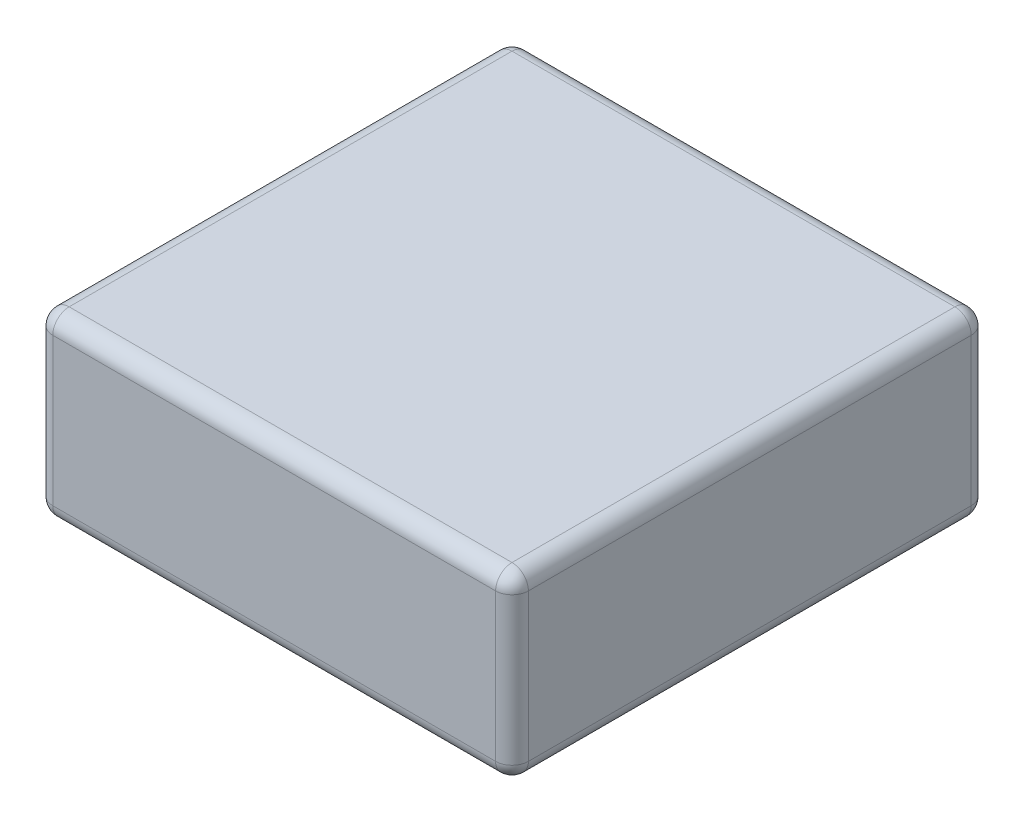
ISO-10303-21;
HEADER;
FILE_DESCRIPTION(('STEP AP214'),'2;1');
FILE_NAME('part.step','',(''),(''),'','','');
FILE_SCHEMA(('AUTOMOTIVE_DESIGN { 1 0 10303 214 1 1 1 1 }'));
ENDSEC;
DATA;
#1=APPLICATION_CONTEXT('core data for automotive mechanical design processes');
#2=APPLICATION_PROTOCOL_DEFINITION('international standard','automotive_design',2000,#1);
#3=PRODUCT_CONTEXT('',#1,'mechanical');
#4=PRODUCT('Part','Part','',(#3));
#5=PRODUCT_RELATED_PRODUCT_CATEGORY('part','',(#4));
#6=PRODUCT_DEFINITION_FORMATION('','',#4);
#7=PRODUCT_DEFINITION_CONTEXT('part definition',#1,'design');
#8=PRODUCT_DEFINITION('design','',#6,#7);
#9=PRODUCT_DEFINITION_SHAPE('','',#8);
#10=(LENGTH_UNIT() NAMED_UNIT(*) SI_UNIT(.MILLI.,.METRE.));
#11=(NAMED_UNIT(*) PLANE_ANGLE_UNIT() SI_UNIT($,.RADIAN.));
#12=(NAMED_UNIT(*) SI_UNIT($,.STERADIAN.) SOLID_ANGLE_UNIT());
#13=UNCERTAINTY_MEASURE_WITH_UNIT(LENGTH_MEASURE(1.E-05),#10,'distance_accuracy_value','');
#14=(GEOMETRIC_REPRESENTATION_CONTEXT(3) GLOBAL_UNCERTAINTY_ASSIGNED_CONTEXT((#13)) GLOBAL_UNIT_ASSIGNED_CONTEXT((#10,
#11,#12)) REPRESENTATION_CONTEXT('',''));
#15=CARTESIAN_POINT('',(0.,0.,0.));
#16=DIRECTION('',(0.,0.,1.));
#17=DIRECTION('',(1.,0.,0.));
#18=AXIS2_PLACEMENT_3D('',#15,#16,#17);
#19=CARTESIAN_POINT('',(9.96034875527012,-1.1,12.1194559594392));
#20=DIRECTION('',(0.,-1.,0.));
#21=DIRECTION('',(0.,0.,-1.));
#22=AXIS2_PLACEMENT_3D('',#19,#20,#21);
#23=PLANE('',#22);
#24=DIRECTION('',(1.,0.,0.));
#25=VECTOR('',#24,1.);
#26=CARTESIAN_POINT('',(10.6853487552701,-1.1,13.4694559594392));
#27=LINE('',#26,#25);
#28=CARTESIAN_POINT('',(8.61034875527012,-1.1,13.4694559594392));
#29=VERTEX_POINT('',#28);
#30=CARTESIAN_POINT('',(11.3103487552701,-1.1,13.4694559594392));
#31=VERTEX_POINT('',#30);
#32=EDGE_CURVE('E197',#29,#31,#27,.T.);
#33=ORIENTED_EDGE('',*,*,#32,.F.);
#34=DIRECTION('',(0.,0.,1.));
#35=VECTOR('',#34,1.);
#36=CARTESIAN_POINT('',(8.61034875527012,-1.1,12.8444559594392));
#37=LINE('',#36,#35);
#38=CARTESIAN_POINT('',(8.61034875527012,-1.1,10.7694559594392));
#39=VERTEX_POINT('',#38);
#40=EDGE_CURVE('E202',#39,#29,#37,.T.);
#41=ORIENTED_EDGE('',*,*,#40,.F.);
#42=DIRECTION('',(-1.,0.,0.));
#43=VECTOR('',#42,1.);
#44=CARTESIAN_POINT('',(9.23534875527012,-1.1,10.7694559594392));
#45=LINE('',#44,#43);
#46=CARTESIAN_POINT('',(11.3103487552701,-1.1,10.7694559594392));
#47=VERTEX_POINT('',#46);
#48=EDGE_CURVE('E134',#47,#39,#45,.T.);
#49=ORIENTED_EDGE('',*,*,#48,.F.);
#50=DIRECTION('',(0.,0.,-1.));
#51=VECTOR('',#50,1.);
#52=CARTESIAN_POINT('',(11.3103487552701,-1.1,11.3944559594392));
#53=LINE('',#52,#51);
#54=EDGE_CURVE('E196',#31,#47,#53,.T.);
#55=ORIENTED_EDGE('',*,*,#54,.F.);
#56=EDGE_LOOP('',(#33,#41,#49,#55));
#57=FACE_BOUND('',#56,.T.);
#58=ADVANCED_FACE('F16',(#57),#23,.T.);
#59=CARTESIAN_POINT('',(11.4103487552701,0.,10.6694559594392));
#60=DIRECTION('',(1.,0.,0.));
#61=DIRECTION('',(0.,1.,0.));
#62=AXIS2_PLACEMENT_3D('',#59,#60,#61);
#63=PLANE('',#62);
#64=DIRECTION('',(0.,0.,-1.));
#65=VECTOR('',#64,1.);
#66=CARTESIAN_POINT('',(11.4103487552701,-0.1,11.3944559594392));
#67=LINE('',#66,#65);
#68=CARTESIAN_POINT('',(11.4103487552701,-0.1,13.4694559594392));
#69=VERTEX_POINT('',#68);
#70=CARTESIAN_POINT('',(11.4103487552701,-0.1,10.7694559594392));
#71=VERTEX_POINT('',#70);
#72=EDGE_CURVE('E126',#69,#71,#67,.T.);
#73=ORIENTED_EDGE('',*,*,#72,.F.);
#74=DIRECTION('',(0.,1.,0.));
#75=VECTOR('',#74,1.);
#76=CARTESIAN_POINT('',(11.4103487552701,0.,13.4694559594392));
#77=LINE('',#76,#75);
#78=CARTESIAN_POINT('',(11.4103487552701,-1.,13.4694559594392));
#79=VERTEX_POINT('',#78);
#80=EDGE_CURVE('E237',#79,#69,#77,.T.);
#81=ORIENTED_EDGE('',*,*,#80,.F.);
#82=DIRECTION('',(0.,0.,1.));
#83=VECTOR('',#82,1.);
#84=CARTESIAN_POINT('',(11.4103487552701,-1.,11.3944559594392));
#85=LINE('',#84,#83);
#86=CARTESIAN_POINT('',(11.4103487552701,-1.,10.7694559594392));
#87=VERTEX_POINT('',#86);
#88=EDGE_CURVE('E128',#87,#79,#85,.T.);
#89=ORIENTED_EDGE('',*,*,#88,.F.);
#90=DIRECTION('',(0.,-1.,0.));
#91=VECTOR('',#90,1.);
#92=CARTESIAN_POINT('',(11.4103487552701,0.,10.7694559594392));
#93=LINE('',#92,#91);
#94=EDGE_CURVE('E123',#71,#87,#93,.T.);
#95=ORIENTED_EDGE('',*,*,#94,.F.);
#96=EDGE_LOOP('',(#73,#81,#89,#95));
#97=FACE_BOUND('',#96,.T.);
#98=ADVANCED_FACE('F18',(#97),#63,.T.);
#99=CARTESIAN_POINT('',(11.4103487552701,0.,13.5694559594392));
#100=DIRECTION('',(0.,0.,1.));
#101=DIRECTION('',(1.,0.,0.));
#102=AXIS2_PLACEMENT_3D('',#99,#100,#101);
#103=PLANE('',#102);
#104=DIRECTION('',(0.,1.,0.));
#105=VECTOR('',#104,1.);
#106=CARTESIAN_POINT('',(8.61034875527012,0.,13.5694559594392));
#107=LINE('',#106,#105);
#108=CARTESIAN_POINT('',(8.61034875527012,-1.,13.5694559594392));
#109=VERTEX_POINT('',#108);
#110=CARTESIAN_POINT('',(8.61034875527012,-0.1,13.5694559594392));
#111=VERTEX_POINT('',#110);
#112=EDGE_CURVE('E261',#109,#111,#107,.T.);
#113=ORIENTED_EDGE('',*,*,#112,.F.);
#114=DIRECTION('',(-1.,0.,0.));
#115=VECTOR('',#114,1.);
#116=CARTESIAN_POINT('',(10.6853487552701,-1.,13.5694559594392));
#117=LINE('',#116,#115);
#118=CARTESIAN_POINT('',(11.3103487552701,-1.,13.5694559594392));
#119=VERTEX_POINT('',#118);
#120=EDGE_CURVE('E192',#119,#109,#117,.T.);
#121=ORIENTED_EDGE('',*,*,#120,.F.);
#122=DIRECTION('',(0.,-1.,0.));
#123=VECTOR('',#122,1.);
#124=CARTESIAN_POINT('',(11.3103487552701,0.,13.5694559594392));
#125=LINE('',#124,#123);
#126=CARTESIAN_POINT('',(11.3103487552701,-0.1,13.5694559594392));
#127=VERTEX_POINT('',#126);
#128=EDGE_CURVE('E239',#127,#119,#125,.T.);
#129=ORIENTED_EDGE('',*,*,#128,.F.);
#130=DIRECTION('',(1.,0.,0.));
#131=VECTOR('',#130,1.);
#132=CARTESIAN_POINT('',(10.6853487552701,-0.1,13.5694559594392));
#133=LINE('',#132,#131);
#134=EDGE_CURVE('E234',#111,#127,#133,.T.);
#135=ORIENTED_EDGE('',*,*,#134,.F.);
#136=EDGE_LOOP('',(#113,#121,#129,#135));
#137=FACE_BOUND('',#136,.T.);
#138=ADVANCED_FACE('F712',(#137),#103,.T.);
#139=CARTESIAN_POINT('',(8.51034875527012,0.,13.5694559594392));
#140=DIRECTION('',(-1.,0.,0.));
#141=DIRECTION('',(0.,0.,1.));
#142=AXIS2_PLACEMENT_3D('',#139,#140,#141);
#143=PLANE('',#142);
#144=DIRECTION('',(0.,0.,1.));
#145=VECTOR('',#144,1.);
#146=CARTESIAN_POINT('',(8.51034875527012,-0.1,12.8444559594392));
#147=LINE('',#146,#145);
#148=CARTESIAN_POINT('',(8.51034875527012,-0.1,10.7694559594392));
#149=VERTEX_POINT('',#148);
#150=CARTESIAN_POINT('',(8.51034875527012,-0.1,13.4694559594392));
#151=VERTEX_POINT('',#150);
#152=EDGE_CURVE('E20',#149,#151,#147,.T.);
#153=ORIENTED_EDGE('',*,*,#152,.F.);
#154=DIRECTION('',(0.,1.,0.));
#155=VECTOR('',#154,1.);
#156=CARTESIAN_POINT('',(8.51034875527012,0.,10.7694559594392));
#157=LINE('',#156,#155);
#158=CARTESIAN_POINT('',(8.51034875527012,-1.,10.7694559594392));
#159=VERTEX_POINT('',#158);
#160=EDGE_CURVE('E27',#159,#149,#157,.T.);
#161=ORIENTED_EDGE('',*,*,#160,.F.);
#162=DIRECTION('',(0.,0.,-1.));
#163=VECTOR('',#162,1.);
#164=CARTESIAN_POINT('',(8.51034875527012,-1.,12.8444559594392));
#165=LINE('',#164,#163);
#166=CARTESIAN_POINT('',(8.51034875527012,-1.,13.4694559594392));
#167=VERTEX_POINT('',#166);
#168=EDGE_CURVE('E283',#167,#159,#165,.T.);
#169=ORIENTED_EDGE('',*,*,#168,.F.);
#170=DIRECTION('',(0.,-1.,0.));
#171=VECTOR('',#170,1.);
#172=CARTESIAN_POINT('',(8.51034875527012,0.,13.4694559594392));
#173=LINE('',#172,#171);
#174=EDGE_CURVE('E265',#151,#167,#173,.T.);
#175=ORIENTED_EDGE('',*,*,#174,.F.);
#176=EDGE_LOOP('',(#153,#161,#169,#175));
#177=FACE_BOUND('',#176,.T.);
#178=ADVANCED_FACE('F381',(#177),#143,.T.);
#179=CARTESIAN_POINT('',(9.96034875527012,0.,12.1194559594392));
#180=DIRECTION('',(0.,-1.,0.));
#181=DIRECTION('',(0.,0.,-1.));
#182=AXIS2_PLACEMENT_3D('',#179,#180,#181);
#183=PLANE('',#182);
#184=DIRECTION('',(1.,0.,0.));
#185=VECTOR('',#184,1.);
#186=CARTESIAN_POINT('',(9.23534875527012,0.,10.7694559594392));
#187=LINE('',#186,#185);
#188=CARTESIAN_POINT('',(8.61034875527012,0.,10.7694559594392));
#189=VERTEX_POINT('',#188);
#190=CARTESIAN_POINT('',(11.3103487552701,0.,10.7694559594392));
#191=VERTEX_POINT('',#190);
#192=EDGE_CURVE('E181',#189,#191,#187,.T.);
#193=ORIENTED_EDGE('',*,*,#192,.F.);
#194=DIRECTION('',(0.,0.,-1.));
#195=VECTOR('',#194,1.);
#196=CARTESIAN_POINT('',(8.61034875527012,0.,12.8444559594392));
#197=LINE('',#196,#195);
#198=CARTESIAN_POINT('',(8.61034875527012,0.,13.4694559594392));
#199=VERTEX_POINT('',#198);
#200=EDGE_CURVE('E266',#199,#189,#197,.T.);
#201=ORIENTED_EDGE('',*,*,#200,.F.);
#202=DIRECTION('',(-1.,0.,0.));
#203=VECTOR('',#202,1.);
#204=CARTESIAN_POINT('',(10.6853487552701,0.,13.4694559594392));
#205=LINE('',#204,#203);
#206=CARTESIAN_POINT('',(11.3103487552701,0.,13.4694559594392));
#207=VERTEX_POINT('',#206);
#208=EDGE_CURVE('E41',#207,#199,#205,.T.);
#209=ORIENTED_EDGE('',*,*,#208,.F.);
#210=DIRECTION('',(0.,0.,1.));
#211=VECTOR('',#210,1.);
#212=CARTESIAN_POINT('',(11.3103487552701,0.,11.3944559594392));
#213=LINE('',#212,#211);
#214=EDGE_CURVE('E147',#191,#207,#213,.T.);
#215=ORIENTED_EDGE('',*,*,#214,.F.);
#216=EDGE_LOOP('',(#193,#201,#209,#215));
#217=FACE_BOUND('',#216,.T.);
#218=ADVANCED_FACE('F321',(#217),#183,.F.);
#219=CARTESIAN_POINT('',(8.51034875527012,0.,10.6694559594392));
#220=DIRECTION('',(0.,0.,-1.));
#221=DIRECTION('',(0.,-1.,0.));
#222=AXIS2_PLACEMENT_3D('',#219,#220,#221);
#223=PLANE('',#222);
#224=DIRECTION('',(-1.,0.,0.));
#225=VECTOR('',#224,1.);
#226=CARTESIAN_POINT('',(9.23534875527012,-0.1,10.6694559594392));
#227=LINE('',#226,#225);
#228=CARTESIAN_POINT('',(11.3103487552701,-0.1,10.6694559594392));
#229=VERTEX_POINT('',#228);
#230=CARTESIAN_POINT('',(8.61034875527012,-0.1,10.6694559594392));
#231=VERTEX_POINT('',#230);
#232=EDGE_CURVE('E157',#229,#231,#227,.T.);
#233=ORIENTED_EDGE('',*,*,#232,.F.);
#234=DIRECTION('',(0.,1.,0.));
#235=VECTOR('',#234,1.);
#236=CARTESIAN_POINT('',(11.3103487552701,0.,10.6694559594392));
#237=LINE('',#236,#235);
#238=CARTESIAN_POINT('',(11.3103487552701,-1.,10.6694559594392));
#239=VERTEX_POINT('',#238);
#240=EDGE_CURVE('E135',#239,#229,#237,.T.);
#241=ORIENTED_EDGE('',*,*,#240,.F.);
#242=DIRECTION('',(1.,0.,0.));
#243=VECTOR('',#242,1.);
#244=CARTESIAN_POINT('',(9.23534875527012,-1.,10.6694559594392));
#245=LINE('',#244,#243);
#246=CARTESIAN_POINT('',(8.61034875527012,-1.,10.6694559594392));
#247=VERTEX_POINT('',#246);
#248=EDGE_CURVE('E198',#247,#239,#245,.T.);
#249=ORIENTED_EDGE('',*,*,#248,.F.);
#250=DIRECTION('',(0.,-1.,0.));
#251=VECTOR('',#250,1.);
#252=CARTESIAN_POINT('',(8.61034875527012,0.,10.6694559594392));
#253=LINE('',#252,#251);
#254=EDGE_CURVE('E10',#231,#247,#253,.T.);
#255=ORIENTED_EDGE('',*,*,#254,.F.);
#256=EDGE_LOOP('',(#233,#241,#249,#255));
#257=FACE_BOUND('',#256,.T.);
#258=ADVANCED_FACE('F374',(#257),#223,.T.);
#259=CARTESIAN_POINT('',(8.61034875527012,0.,10.7694559594392));
#260=DIRECTION('',(0.,-1.,0.));
#261=DIRECTION('',(-0.70710678118654,0.,-0.707106781186555));
#262=AXIS2_PLACEMENT_3D('',#259,#260,#261);
#263=CYLINDRICAL_SURFACE('',#262,0.1);
#264=CARTESIAN_POINT('',(8.61034875527012,-1.,10.7694559594392));
#265=DIRECTION('',(0.,1.,0.));
#266=DIRECTION('',(0.,0.,-1.));
#267=AXIS2_PLACEMENT_3D('',#264,#265,#266);
#268=CIRCLE('',#267,0.1);
#269=EDGE_CURVE('E182',#247,#159,#268,.T.);
#270=ORIENTED_EDGE('',*,*,#269,.T.);
#271=ORIENTED_EDGE('',*,*,#160,.T.);
#272=CARTESIAN_POINT('',(8.61034875527012,-0.1,10.7694559594392));
#273=DIRECTION('',(0.,-1.,0.));
#274=DIRECTION('',(-1.,0.,0.));
#275=AXIS2_PLACEMENT_3D('',#272,#273,#274);
#276=CIRCLE('',#275,0.1);
#277=EDGE_CURVE('E191',#149,#231,#276,.T.);
#278=ORIENTED_EDGE('',*,*,#277,.T.);
#279=ORIENTED_EDGE('',*,*,#254,.T.);
#280=EDGE_LOOP('',(#270,#271,#278,#279));
#281=FACE_BOUND('',#280,.T.);
#282=ADVANCED_FACE('F376',(#281),#263,.T.);
#283=CARTESIAN_POINT('',(8.61034875527012,-1.,12.8444559594392));
#284=DIRECTION('',(0.,0.,-1.));
#285=DIRECTION('',(-0.707106781186548,-0.707106781186548,0.));
#286=AXIS2_PLACEMENT_3D('',#283,#284,#285);
#287=CYLINDRICAL_SURFACE('',#286,0.1);
#288=CARTESIAN_POINT('',(8.61034875527012,-1.,10.7694559594392));
#289=DIRECTION('',(0.,0.,1.));
#290=DIRECTION('',(-1.,0.,0.));
#291=AXIS2_PLACEMENT_3D('',#288,#289,#290);
#292=CIRCLE('',#291,0.1);
#293=EDGE_CURVE('E187',#159,#39,#292,.T.);
#294=ORIENTED_EDGE('',*,*,#293,.T.);
#295=ORIENTED_EDGE('',*,*,#40,.T.);
#296=CARTESIAN_POINT('',(8.61034875527012,-1.,13.4694559594392));
#297=DIRECTION('',(0.,0.,-1.));
#298=DIRECTION('',(0.,-1.,0.));
#299=AXIS2_PLACEMENT_3D('',#296,#297,#298);
#300=CIRCLE('',#299,0.1);
#301=EDGE_CURVE('E206',#29,#167,#300,.T.);
#302=ORIENTED_EDGE('',*,*,#301,.T.);
#303=ORIENTED_EDGE('',*,*,#168,.T.);
#304=EDGE_LOOP('',(#294,#295,#302,#303));
#305=FACE_BOUND('',#304,.T.);
#306=ADVANCED_FACE('F673',(#305),#287,.T.);
#307=CARTESIAN_POINT('',(9.23534875527012,-1.,10.7694559594392));
#308=DIRECTION('',(1.,0.,0.));
#309=DIRECTION('',(0.,-0.70710678118654,-0.707106781186555));
#310=AXIS2_PLACEMENT_3D('',#307,#308,#309);
#311=CYLINDRICAL_SURFACE('',#310,0.1);
#312=CARTESIAN_POINT('',(11.3103487552701,-1.,10.7694559594392));
#313=DIRECTION('',(-1.,0.,0.));
#314=DIRECTION('',(0.,0.,-1.));
#315=AXIS2_PLACEMENT_3D('',#312,#313,#314);
#316=CIRCLE('',#315,0.1);
#317=EDGE_CURVE('E228',#239,#47,#316,.T.);
#318=ORIENTED_EDGE('',*,*,#317,.T.);
#319=ORIENTED_EDGE('',*,*,#48,.T.);
#320=CARTESIAN_POINT('',(8.61034875527012,-1.,10.7694559594392));
#321=DIRECTION('',(1.,0.,0.));
#322=DIRECTION('',(0.,-1.,0.));
#323=AXIS2_PLACEMENT_3D('',#320,#321,#322);
#324=CIRCLE('',#323,0.1);
#325=EDGE_CURVE('E186',#39,#247,#324,.T.);
#326=ORIENTED_EDGE('',*,*,#325,.T.);
#327=ORIENTED_EDGE('',*,*,#248,.T.);
#328=EDGE_LOOP('',(#318,#319,#326,#327));
#329=FACE_BOUND('',#328,.T.);
#330=ADVANCED_FACE('F369',(#329),#311,.T.);
#331=CARTESIAN_POINT('',(11.3103487552701,0.,10.7694559594392));
#332=DIRECTION('',(0.,-1.,0.));
#333=DIRECTION('',(0.707106781186563,0.,-0.707106781186532));
#334=AXIS2_PLACEMENT_3D('',#331,#332,#333);
#335=CYLINDRICAL_SURFACE('',#334,0.1);
#336=CARTESIAN_POINT('',(11.3103487552701,-1.,10.7694559594392));
#337=DIRECTION('',(0.,1.,0.));
#338=DIRECTION('',(1.,0.,0.));
#339=AXIS2_PLACEMENT_3D('',#336,#337,#338);
#340=CIRCLE('',#339,0.1);
#341=EDGE_CURVE('E171',#87,#239,#340,.T.);
#342=ORIENTED_EDGE('',*,*,#341,.T.);
#343=ORIENTED_EDGE('',*,*,#240,.T.);
#344=CARTESIAN_POINT('',(11.3103487552701,-0.1,10.7694559594392));
#345=DIRECTION('',(0.,-1.,0.));
#346=DIRECTION('',(0.,0.,-1.));
#347=AXIS2_PLACEMENT_3D('',#344,#345,#346);
#348=CIRCLE('',#347,0.0999999999999979);
#349=EDGE_CURVE('E153',#229,#71,#348,.T.);
#350=ORIENTED_EDGE('',*,*,#349,.T.);
#351=ORIENTED_EDGE('',*,*,#94,.T.);
#352=EDGE_LOOP('',(#342,#343,#350,#351));
#353=FACE_BOUND('',#352,.T.);
#354=ADVANCED_FACE('F159',(#353),#335,.T.);
#355=CARTESIAN_POINT('',(11.3103487552701,-1.,11.3944559594392));
#356=DIRECTION('',(0.,0.,1.));
#357=DIRECTION('',(0.707106781186555,-0.70710678118654,0.));
#358=AXIS2_PLACEMENT_3D('',#355,#356,#357);
#359=CYLINDRICAL_SURFACE('',#358,0.1);
#360=CARTESIAN_POINT('',(11.3103487552701,-1.,13.4694559594392));
#361=DIRECTION('',(0.,0.,-1.));
#362=DIRECTION('',(1.,0.,0.));
#363=AXIS2_PLACEMENT_3D('',#360,#361,#362);
#364=CIRCLE('',#363,0.1);
#365=EDGE_CURVE('E224',#79,#31,#364,.T.);
#366=ORIENTED_EDGE('',*,*,#365,.T.);
#367=ORIENTED_EDGE('',*,*,#54,.T.);
#368=CARTESIAN_POINT('',(11.3103487552701,-1.,10.7694559594392));
#369=DIRECTION('',(0.,0.,1.));
#370=DIRECTION('',(0.,-1.,0.));
#371=AXIS2_PLACEMENT_3D('',#368,#369,#370);
#372=CIRCLE('',#371,0.1);
#373=EDGE_CURVE('E163',#47,#87,#372,.T.);
#374=ORIENTED_EDGE('',*,*,#373,.T.);
#375=ORIENTED_EDGE('',*,*,#88,.T.);
#376=EDGE_LOOP('',(#366,#367,#374,#375));
#377=FACE_BOUND('',#376,.T.);
#378=ADVANCED_FACE('F649',(#377),#359,.T.);
#379=CARTESIAN_POINT('',(10.6853487552701,-1.,13.4694559594392));
#380=DIRECTION('',(-1.,0.,0.));
#381=DIRECTION('',(0.,-0.70710678118654,0.707106781186555));
#382=AXIS2_PLACEMENT_3D('',#379,#380,#381);
#383=CYLINDRICAL_SURFACE('',#382,0.1);
#384=CARTESIAN_POINT('',(8.61034875527012,-1.,13.4694559594392));
#385=DIRECTION('',(1.,0.,0.));
#386=DIRECTION('',(0.,0.,1.));
#387=AXIS2_PLACEMENT_3D('',#384,#385,#386);
#388=CIRCLE('',#387,0.1);
#389=EDGE_CURVE('E207',#109,#29,#388,.T.);
#390=ORIENTED_EDGE('',*,*,#389,.T.);
#391=ORIENTED_EDGE('',*,*,#32,.T.);
#392=CARTESIAN_POINT('',(11.3103487552701,-1.,13.4694559594392));
#393=DIRECTION('',(-1.,0.,0.));
#394=DIRECTION('',(0.,-1.,0.));
#395=AXIS2_PLACEMENT_3D('',#392,#393,#394);
#396=CIRCLE('',#395,0.1);
#397=EDGE_CURVE('E223',#31,#119,#396,.T.);
#398=ORIENTED_EDGE('',*,*,#397,.T.);
#399=ORIENTED_EDGE('',*,*,#120,.T.);
#400=EDGE_LOOP('',(#390,#391,#398,#399));
#401=FACE_BOUND('',#400,.T.);
#402=ADVANCED_FACE('F298',(#401),#383,.T.);
#403=CARTESIAN_POINT('',(11.3103487552701,0.,13.4694559594392));
#404=DIRECTION('',(0.,-1.,0.));
#405=DIRECTION('',(0.707106781186532,0.,0.707106781186563));
#406=AXIS2_PLACEMENT_3D('',#403,#404,#405);
#407=CYLINDRICAL_SURFACE('',#406,0.1);
#408=CARTESIAN_POINT('',(11.3103487552701,-1.,13.4694559594392));
#409=DIRECTION('',(0.,1.,0.));
#410=DIRECTION('',(0.,0.,1.));
#411=AXIS2_PLACEMENT_3D('',#408,#409,#410);
#412=CIRCLE('',#411,0.1);
#413=EDGE_CURVE('E219',#119,#79,#412,.T.);
#414=ORIENTED_EDGE('',*,*,#413,.T.);
#415=ORIENTED_EDGE('',*,*,#80,.T.);
#416=CARTESIAN_POINT('',(11.3103487552701,-0.1,13.4694559594392));
#417=DIRECTION('',(0.,-1.,0.));
#418=DIRECTION('',(1.,0.,0.));
#419=AXIS2_PLACEMENT_3D('',#416,#417,#418);
#420=CIRCLE('',#419,0.0999999999999979);
#421=EDGE_CURVE('E269',#69,#127,#420,.T.);
#422=ORIENTED_EDGE('',*,*,#421,.T.);
#423=ORIENTED_EDGE('',*,*,#128,.T.);
#424=EDGE_LOOP('',(#414,#415,#422,#423));
#425=FACE_BOUND('',#424,.T.);
#426=ADVANCED_FACE('F634',(#425),#407,.T.);
#427=CARTESIAN_POINT('',(10.6853487552701,-0.1,13.4694559594392));
#428=DIRECTION('',(-1.,0.,0.));
#429=DIRECTION('',(0.,0.707106781186539,0.707106781186556));
#430=AXIS2_PLACEMENT_3D('',#427,#428,#429);
#431=CYLINDRICAL_SURFACE('',#430,0.1);
#432=CARTESIAN_POINT('',(8.61034875527012,-0.1,13.4694559594392));
#433=DIRECTION('',(1.,0.,0.));
#434=DIRECTION('',(0.,1.,0.));
#435=AXIS2_PLACEMENT_3D('',#432,#433,#434);
#436=CIRCLE('',#435,0.1);
#437=EDGE_CURVE('E176',#199,#111,#436,.T.);
#438=ORIENTED_EDGE('',*,*,#437,.T.);
#439=ORIENTED_EDGE('',*,*,#134,.T.);
#440=CARTESIAN_POINT('',(11.3103487552701,-0.1,13.4694559594392));
#441=DIRECTION('',(-1.,0.,0.));
#442=DIRECTION('',(0.,0.,1.));
#443=AXIS2_PLACEMENT_3D('',#440,#441,#442);
#444=CIRCLE('',#443,0.100000000000002);
#445=EDGE_CURVE('E148',#127,#207,#444,.T.);
#446=ORIENTED_EDGE('',*,*,#445,.T.);
#447=ORIENTED_EDGE('',*,*,#208,.T.);
#448=EDGE_LOOP('',(#438,#439,#446,#447));
#449=FACE_BOUND('',#448,.T.);
#450=ADVANCED_FACE('F351',(#449),#431,.T.);
#451=CARTESIAN_POINT('',(11.3103487552701,-0.1,11.3944559594392));
#452=DIRECTION('',(0.,0.,1.));
#453=DIRECTION('',(0.707106781186556,0.707106781186539,0.));
#454=AXIS2_PLACEMENT_3D('',#451,#452,#453);
#455=CYLINDRICAL_SURFACE('',#454,0.1);
#456=CARTESIAN_POINT('',(11.3103487552701,-0.1,13.4694559594392));
#457=DIRECTION('',(0.,0.,-1.));
#458=DIRECTION('',(0.,1.,0.));
#459=AXIS2_PLACEMENT_3D('',#456,#457,#458);
#460=CIRCLE('',#459,0.1);
#461=EDGE_CURVE('E144',#207,#69,#460,.T.);
#462=ORIENTED_EDGE('',*,*,#461,.T.);
#463=ORIENTED_EDGE('',*,*,#72,.T.);
#464=CARTESIAN_POINT('',(11.3103487552701,-0.1,10.7694559594392));
#465=DIRECTION('',(0.,0.,1.));
#466=DIRECTION('',(1.,0.,0.));
#467=AXIS2_PLACEMENT_3D('',#464,#465,#466);
#468=CIRCLE('',#467,0.1);
#469=EDGE_CURVE('E141',#71,#191,#468,.T.);
#470=ORIENTED_EDGE('',*,*,#469,.T.);
#471=ORIENTED_EDGE('',*,*,#214,.T.);
#472=EDGE_LOOP('',(#462,#463,#470,#471));
#473=FACE_BOUND('',#472,.T.);
#474=ADVANCED_FACE('F140',(#473),#455,.T.);
#475=CARTESIAN_POINT('',(11.3103487552701,-0.1,13.4694559594392));
#476=DIRECTION('',(0.408248290463843,-0.816496580927737,0.408248290463861));
#477=DIRECTION('',(0.577350269189623,0.577350269189613,0.577350269189641));
#478=AXIS2_PLACEMENT_3D('',#475,#476,#477);
#479=SPHERICAL_SURFACE('',#478,0.1);
#480=ORIENTED_EDGE('',*,*,#421,.F.);
#481=ORIENTED_EDGE('',*,*,#461,.F.);
#482=ORIENTED_EDGE('',*,*,#445,.F.);
#483=EDGE_LOOP('',(#480,#481,#482));
#484=FACE_BOUND('',#483,.T.);
#485=ADVANCED_FACE('F353',(#484),#479,.T.);
#486=CARTESIAN_POINT('',(11.3103487552701,-1.,13.4694559594392));
#487=DIRECTION('',(-0.408248290463859,-0.816496580927721,-0.408248290463877));
#488=DIRECTION('',(0.577350269189604,-0.577350269189635,0.577350269189639));
#489=AXIS2_PLACEMENT_3D('',#486,#487,#488);
#490=SPHERICAL_SURFACE('',#489,0.1);
#491=ORIENTED_EDGE('',*,*,#365,.F.);
#492=ORIENTED_EDGE('',*,*,#413,.F.);
#493=ORIENTED_EDGE('',*,*,#397,.F.);
#494=EDGE_LOOP('',(#491,#492,#493));
#495=FACE_BOUND('',#494,.T.);
#496=ADVANCED_FACE('F600',(#495),#490,.T.);
#497=CARTESIAN_POINT('',(8.61034875527012,0.,13.4694559594392));
#498=DIRECTION('',(0.,-1.,0.));
#499=DIRECTION('',(-0.707106781186555,0.,0.70710678118654));
#500=AXIS2_PLACEMENT_3D('',#497,#498,#499);
#501=CYLINDRICAL_SURFACE('',#500,0.1);
#502=CARTESIAN_POINT('',(8.61034875527012,-1.,13.4694559594392));
#503=DIRECTION('',(0.,1.,0.));
#504=DIRECTION('',(-1.,0.,0.));
#505=AXIS2_PLACEMENT_3D('',#502,#503,#504);
#506=CIRCLE('',#505,0.1);
#507=EDGE_CURVE('E203',#167,#109,#506,.T.);
#508=ORIENTED_EDGE('',*,*,#507,.T.);
#509=ORIENTED_EDGE('',*,*,#112,.T.);
#510=CARTESIAN_POINT('',(8.61034875527012,-0.1,13.4694559594392));
#511=DIRECTION('',(0.,-1.,0.));
#512=DIRECTION('',(0.,0.,1.));
#513=AXIS2_PLACEMENT_3D('',#510,#511,#512);
#514=CIRCLE('',#513,0.0999999999999979);
#515=EDGE_CURVE('E277',#111,#151,#514,.T.);
#516=ORIENTED_EDGE('',*,*,#515,.T.);
#517=ORIENTED_EDGE('',*,*,#174,.T.);
#518=EDGE_LOOP('',(#508,#509,#516,#517));
#519=FACE_BOUND('',#518,.T.);
#520=ADVANCED_FACE('F590',(#519),#501,.T.);
#521=CARTESIAN_POINT('',(8.61034875527012,-0.1,12.8444559594392));
#522=DIRECTION('',(0.,0.,-1.));
#523=DIRECTION('',(-0.707106781186548,0.707106781186547,0.));
#524=AXIS2_PLACEMENT_3D('',#521,#522,#523);
#525=CYLINDRICAL_SURFACE('',#524,0.1);
#526=CARTESIAN_POINT('',(8.61034875527012,-0.1,10.7694559594392));
#527=DIRECTION('',(0.,0.,1.));
#528=DIRECTION('',(0.,1.,0.));
#529=AXIS2_PLACEMENT_3D('',#526,#527,#528);
#530=CIRCLE('',#529,0.1);
#531=EDGE_CURVE('E218',#189,#149,#530,.T.);
#532=ORIENTED_EDGE('',*,*,#531,.T.);
#533=ORIENTED_EDGE('',*,*,#152,.T.);
#534=CARTESIAN_POINT('',(8.61034875527012,-0.1,13.4694559594392));
#535=DIRECTION('',(0.,0.,-1.));
#536=DIRECTION('',(-1.,0.,0.));
#537=AXIS2_PLACEMENT_3D('',#534,#535,#536);
#538=CIRCLE('',#537,0.1);
#539=EDGE_CURVE('E180',#151,#199,#538,.T.);
#540=ORIENTED_EDGE('',*,*,#539,.T.);
#541=ORIENTED_EDGE('',*,*,#200,.T.);
#542=EDGE_LOOP('',(#532,#533,#540,#541));
#543=FACE_BOUND('',#542,.T.);
#544=ADVANCED_FACE('F314',(#543),#525,.T.);
#545=CARTESIAN_POINT('',(8.61034875527012,-0.1,13.4694559594392));
#546=DIRECTION('',(-0.408248290463845,0.408248290463848,-0.816496580927743));
#547=DIRECTION('',(-0.577350269189638,0.577350269189637,0.577350269189603));
#548=AXIS2_PLACEMENT_3D('',#545,#546,#547);
#549=SPHERICAL_SURFACE('',#548,0.1);
#550=ORIENTED_EDGE('',*,*,#437,.F.);
#551=ORIENTED_EDGE('',*,*,#539,.F.);
#552=ORIENTED_EDGE('',*,*,#515,.F.);
#553=EDGE_LOOP('',(#550,#551,#552));
#554=FACE_BOUND('',#553,.T.);
#555=ADVANCED_FACE('F570',(#554),#549,.T.);
#556=CARTESIAN_POINT('',(9.23534875527012,-0.1,10.7694559594392));
#557=DIRECTION('',(1.,0.,0.));
#558=DIRECTION('',(0.,0.707106781186539,-0.707106781186556));
#559=AXIS2_PLACEMENT_3D('',#556,#557,#558);
#560=CYLINDRICAL_SURFACE('',#559,0.1);
#561=CARTESIAN_POINT('',(11.3103487552701,-0.1,10.7694559594392));
#562=DIRECTION('',(-1.,0.,0.));
#563=DIRECTION('',(0.,1.,0.));
#564=AXIS2_PLACEMENT_3D('',#561,#562,#563);
#565=CIRCLE('',#564,0.1);
#566=EDGE_CURVE('E155',#191,#229,#565,.T.);
#567=ORIENTED_EDGE('',*,*,#566,.T.);
#568=ORIENTED_EDGE('',*,*,#232,.T.);
#569=CARTESIAN_POINT('',(8.61034875527012,-0.1,10.7694559594392));
#570=DIRECTION('',(1.,0.,0.));
#571=DIRECTION('',(0.,0.,-1.));
#572=AXIS2_PLACEMENT_3D('',#569,#570,#571);
#573=CIRCLE('',#572,0.100000000000002);
#574=EDGE_CURVE('E214',#231,#189,#573,.T.);
#575=ORIENTED_EDGE('',*,*,#574,.T.);
#576=ORIENTED_EDGE('',*,*,#192,.T.);
#577=EDGE_LOOP('',(#567,#568,#575,#576));
#578=FACE_BOUND('',#577,.T.);
#579=ADVANCED_FACE('F327',(#578),#560,.T.);
#580=CARTESIAN_POINT('',(11.3103487552701,-0.1,10.7694559594392));
#581=DIRECTION('',(0.408248290463843,-0.816496580927737,-0.408248290463861));
#582=DIRECTION('',(0.577350269189605,0.577350269189613,-0.577350269189659));
#583=AXIS2_PLACEMENT_3D('',#580,#581,#582);
#584=SPHERICAL_SURFACE('',#583,0.1);
#585=ORIENTED_EDGE('',*,*,#349,.F.);
#586=ORIENTED_EDGE('',*,*,#566,.F.);
#587=ORIENTED_EDGE('',*,*,#469,.F.);
#588=EDGE_LOOP('',(#585,#586,#587));
#589=FACE_BOUND('',#588,.T.);
#590=ADVANCED_FACE('F152',(#589),#584,.T.);
#591=CARTESIAN_POINT('',(11.3103487552701,-1.,10.7694559594392));
#592=DIRECTION('',(-0.816496580927719,-0.40824829046388,-0.40824829046386));
#593=DIRECTION('',(0.577350269189639,-0.577350269189635,-0.577350269189604));
#594=AXIS2_PLACEMENT_3D('',#591,#592,#593);
#595=SPHERICAL_SURFACE('',#594,0.1);
#596=ORIENTED_EDGE('',*,*,#317,.F.);
#597=ORIENTED_EDGE('',*,*,#341,.F.);
#598=ORIENTED_EDGE('',*,*,#373,.F.);
#599=EDGE_LOOP('',(#596,#597,#598));
#600=FACE_BOUND('',#599,.T.);
#601=ADVANCED_FACE('F367',(#600),#595,.T.);
#602=CARTESIAN_POINT('',(8.61034875527012,-1.,13.4694559594392));
#603=DIRECTION('',(-0.81649658092772,0.408248290463879,-0.40824829046386));
#604=DIRECTION('',(-0.577350269189639,-0.577350269189635,0.577350269189604));
#605=AXIS2_PLACEMENT_3D('',#602,#603,#604);
#606=SPHERICAL_SURFACE('',#605,0.1);
#607=ORIENTED_EDGE('',*,*,#389,.F.);
#608=ORIENTED_EDGE('',*,*,#507,.F.);
#609=ORIENTED_EDGE('',*,*,#301,.F.);
#610=EDGE_LOOP('',(#607,#608,#609));
#611=FACE_BOUND('',#610,.T.);
#612=ADVANCED_FACE('F305',(#611),#606,.T.);
#613=CARTESIAN_POINT('',(8.61034875527012,-0.1,10.7694559594392));
#614=DIRECTION('',(-0.408248290463844,-0.816496580927736,-0.408248290463862));
#615=DIRECTION('',(-0.577350269189622,0.577350269189616,-0.577350269189639));
#616=AXIS2_PLACEMENT_3D('',#613,#614,#615);
#617=SPHERICAL_SURFACE('',#616,0.1);
#618=ORIENTED_EDGE('',*,*,#277,.F.);
#619=ORIENTED_EDGE('',*,*,#531,.F.);
#620=ORIENTED_EDGE('',*,*,#574,.F.);
#621=EDGE_LOOP('',(#618,#619,#620));
#622=FACE_BOUND('',#621,.T.);
#623=ADVANCED_FACE('F330',(#622),#617,.T.);
#624=CARTESIAN_POINT('',(8.61034875527012,-1.,10.7694559594392));
#625=DIRECTION('',(0.40824829046386,-0.816496580927729,0.40824829046386));
#626=DIRECTION('',(-0.577350269189624,-0.577350269189629,-0.577350269189624));
#627=AXIS2_PLACEMENT_3D('',#624,#625,#626);
#628=SPHERICAL_SURFACE('',#627,0.1);
#629=ORIENTED_EDGE('',*,*,#293,.F.);
#630=ORIENTED_EDGE('',*,*,#269,.F.);
#631=ORIENTED_EDGE('',*,*,#325,.F.);
#632=EDGE_LOOP('',(#629,#630,#631));
#633=FACE_BOUND('',#632,.T.);
#634=ADVANCED_FACE('F499',(#633),#628,.T.);
#635=CLOSED_SHELL('',(#58,#98,#138,#178,#218,#258,#282,#306,#330,#354,#378,#402,#426,#450,#474,
#485,#496,#520,#544,#555,#579,#590,#601,#612,#623,#634));
#636=MANIFOLD_SOLID_BREP('B1',#635);
#637=ADVANCED_BREP_SHAPE_REPRESENTATION('',(#18,#636),#14);
#638=SHAPE_DEFINITION_REPRESENTATION(#9,#637);
ENDSEC;
END-ISO-10303-21;
